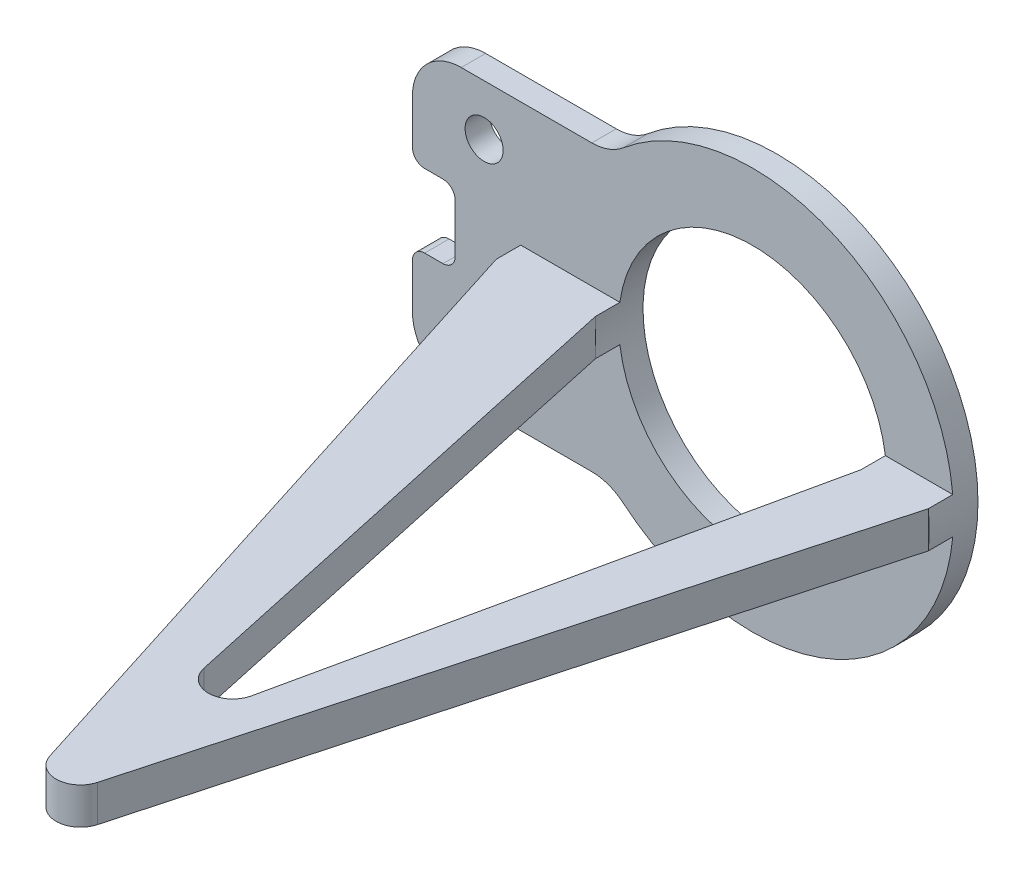
ISO-10303-21;
HEADER;
FILE_DESCRIPTION(('STEP AP214'),'2;1');
FILE_NAME('part.step','',(''),(''),'','','');
FILE_SCHEMA(('AUTOMOTIVE_DESIGN { 1 0 10303 214 1 1 1 1 }'));
ENDSEC;
DATA;
#1=APPLICATION_CONTEXT('core data for automotive mechanical design processes');
#2=APPLICATION_PROTOCOL_DEFINITION('international standard','automotive_design',2000,#1);
#3=PRODUCT_CONTEXT('',#1,'mechanical');
#4=PRODUCT('Part','Part','',(#3));
#5=PRODUCT_RELATED_PRODUCT_CATEGORY('part','',(#4));
#6=PRODUCT_DEFINITION_FORMATION('','',#4);
#7=PRODUCT_DEFINITION_CONTEXT('part definition',#1,'design');
#8=PRODUCT_DEFINITION('design','',#6,#7);
#9=PRODUCT_DEFINITION_SHAPE('','',#8);
#10=(LENGTH_UNIT() NAMED_UNIT(*) SI_UNIT(.MILLI.,.METRE.));
#11=(NAMED_UNIT(*) PLANE_ANGLE_UNIT() SI_UNIT($,.RADIAN.));
#12=(NAMED_UNIT(*) SI_UNIT($,.STERADIAN.) SOLID_ANGLE_UNIT());
#13=UNCERTAINTY_MEASURE_WITH_UNIT(LENGTH_MEASURE(1.E-05),#10,'distance_accuracy_value','');
#14=(GEOMETRIC_REPRESENTATION_CONTEXT(3) GLOBAL_UNCERTAINTY_ASSIGNED_CONTEXT((#13)) GLOBAL_UNIT_ASSIGNED_CONTEXT((#10,
#11,#12)) REPRESENTATION_CONTEXT('',''));
#15=CARTESIAN_POINT('',(0.,0.,0.));
#16=DIRECTION('',(0.,0.,1.));
#17=DIRECTION('',(1.,0.,0.));
#18=AXIS2_PLACEMENT_3D('',#15,#16,#17);
#19=CARTESIAN_POINT('',(-27.8733122804794,7.66726188957801,2.));
#20=DIRECTION('',(1.,0.,0.));
#21=DIRECTION('',(0.,0.,-1.));
#22=AXIS2_PLACEMENT_3D('',#19,#20,#21);
#23=PLANE('',#22);
#24=DIRECTION('',(0.,-1.,0.));
#25=VECTOR('',#24,1.);
#26=CARTESIAN_POINT('',(-27.8733122804794,7.66726188957801,0.));
#27=LINE('',#26,#25);
#28=CARTESIAN_POINT('',(-27.8733122804794,7.66726188957801,0.));
#29=VERTEX_POINT('',#28);
#30=CARTESIAN_POINT('',(-27.8733122804794,4.,0.));
#31=VERTEX_POINT('',#30);
#32=EDGE_CURVE('E381',#29,#31,#27,.T.);
#33=ORIENTED_EDGE('',*,*,#32,.T.);
#34=DIRECTION('',(0.,0.,1.));
#35=VECTOR('',#34,1.);
#36=CARTESIAN_POINT('',(-27.8733122804794,4.,2.));
#37=LINE('',#36,#35);
#38=CARTESIAN_POINT('',(-27.8733122804794,4.,2.));
#39=VERTEX_POINT('',#38);
#40=EDGE_CURVE('E418',#31,#39,#37,.T.);
#41=ORIENTED_EDGE('',*,*,#40,.T.);
#42=DIRECTION('',(0.,-1.,0.));
#43=VECTOR('',#42,1.);
#44=CARTESIAN_POINT('',(-27.8733122804794,7.66726188957801,2.));
#45=LINE('',#44,#43);
#46=CARTESIAN_POINT('',(-27.8733122804794,7.66726188957801,2.));
#47=VERTEX_POINT('',#46);
#48=EDGE_CURVE('E360',#47,#39,#45,.T.);
#49=ORIENTED_EDGE('',*,*,#48,.F.);
#50=DIRECTION('',(0.,0.,-1.));
#51=VECTOR('',#50,1.);
#52=CARTESIAN_POINT('',(-27.8733122804794,7.66726188957801,2.));
#53=LINE('',#52,#51);
#54=EDGE_CURVE('E415',#47,#29,#53,.T.);
#55=ORIENTED_EDGE('',*,*,#54,.T.);
#56=EDGE_LOOP('',(#33,#41,#49,#55));
#57=FACE_BOUND('',#56,.T.);
#58=ADVANCED_FACE('F39',(#57),#23,.F.);
#59=CARTESIAN_POINT('',(-23.8733122804794,7.66726188957804,2.));
#60=DIRECTION('',(0.,0.,1.));
#61=DIRECTION('',(1.,0.,0.));
#62=AXIS2_PLACEMENT_3D('',#59,#60,#61);
#63=PLANE('',#62);
#64=DIRECTION('',(1.,0.,0.));
#65=VECTOR('',#64,1.);
#66=CARTESIAN_POINT('',(-23.8733122804794,-3.,2.));
#67=LINE('',#66,#65);
#68=CARTESIAN_POINT('',(-26.8733122804794,-3.,2.));
#69=VERTEX_POINT('',#68);
#70=CARTESIAN_POINT('',(-25.3733122804794,-3.,2.));
#71=VERTEX_POINT('',#70);
#72=EDGE_CURVE('E456',#69,#71,#67,.T.);
#73=ORIENTED_EDGE('',*,*,#72,.F.);
#74=CARTESIAN_POINT('',(-26.8733122804794,-4.,2.));
#75=DIRECTION('',(0.,0.,1.));
#76=DIRECTION('',(1.,0.,0.));
#77=AXIS2_PLACEMENT_3D('',#74,#75,#76);
#78=CIRCLE('',#77,1.);
#79=CARTESIAN_POINT('',(-27.8733122804794,-4.,2.));
#80=VERTEX_POINT('',#79);
#81=EDGE_CURVE('E443',#69,#80,#78,.T.);
#82=ORIENTED_EDGE('',*,*,#81,.T.);
#83=CARTESIAN_POINT('',(-27.8733122804794,-7.66726188957804,2.));
#84=VERTEX_POINT('',#83);
#85=EDGE_CURVE('E358',#80,#84,#45,.T.);
#86=ORIENTED_EDGE('',*,*,#85,.T.);
#87=CARTESIAN_POINT('',(-23.8733122804794,-7.66726188957806,2.));
#88=DIRECTION('',(0.,0.,1.));
#89=DIRECTION('',(1.,0.,0.));
#90=AXIS2_PLACEMENT_3D('',#87,#88,#89);
#91=CIRCLE('',#90,4.);
#92=CARTESIAN_POINT('',(-23.8733122804794,-11.6672618895781,2.));
#93=VERTEX_POINT('',#92);
#94=EDGE_CURVE('E363',#84,#93,#91,.T.);
#95=ORIENTED_EDGE('',*,*,#94,.T.);
#96=DIRECTION('',(1.,0.,0.));
#97=VECTOR('',#96,1.);
#98=CARTESIAN_POINT('',(-23.8733122804794,-11.6672618895781,2.));
#99=LINE('',#98,#97);
#100=CARTESIAN_POINT('',(-13.173260362044,-11.6672618895781,2.));
#101=VERTEX_POINT('',#100);
#102=EDGE_CURVE('E365',#93,#101,#99,.T.);
#103=ORIENTED_EDGE('',*,*,#102,.T.);
#104=CARTESIAN_POINT('',(-13.173260362044,-15.6672618895781,2.));
#105=DIRECTION('',(0.,0.,-1.));
#106=DIRECTION('',(1.,0.,0.));
#107=AXIS2_PLACEMENT_3D('',#104,#105,#106);
#108=CIRCLE('',#107,4.);
#109=CARTESIAN_POINT('',(-10.5990303331877,-12.6056708393994,2.));
#110=VERTEX_POINT('',#109);
#111=EDGE_CURVE('E367',#101,#110,#108,.T.);
#112=ORIENTED_EDGE('',*,*,#111,.T.);
#113=CARTESIAN_POINT('',(0.,0.,2.));
#114=DIRECTION('',(0.,0.,1.));
#115=DIRECTION('',(-1.,0.,0.));
#116=AXIS2_PLACEMENT_3D('',#113,#114,#115);
#117=CIRCLE('',#116,16.4694377959637);
#118=CARTESIAN_POINT('',(16.4009872055043,-1.5,2.));
#119=VERTEX_POINT('',#118);
#120=EDGE_CURVE('E370',#110,#119,#117,.T.);
#121=ORIENTED_EDGE('',*,*,#120,.T.);
#122=DIRECTION('',(1.,0.,0.));
#123=VECTOR('',#122,1.);
#124=CARTESIAN_POINT('',(10.8781039636384,-1.5,2.));
#125=LINE('',#124,#123);
#126=CARTESIAN_POINT('',(10.8781039636384,-1.5,2.));
#127=VERTEX_POINT('',#126);
#128=EDGE_CURVE('E306',#127,#119,#125,.T.);
#129=ORIENTED_EDGE('',*,*,#128,.F.);
#130=CARTESIAN_POINT('',(0.,0.,2.));
#131=DIRECTION('',(0.,0.,1.));
#132=DIRECTION('',(1.,0.,0.));
#133=AXIS2_PLACEMENT_3D('',#130,#131,#132);
#134=CIRCLE('',#133,10.9810357363832);
#135=CARTESIAN_POINT('',(-10.8781039636384,-1.5,2.));
#136=VERTEX_POINT('',#135);
#137=EDGE_CURVE('E348',#136,#127,#134,.T.);
#138=ORIENTED_EDGE('',*,*,#137,.F.);
#139=DIRECTION('',(1.,0.,0.));
#140=VECTOR('',#139,1.);
#141=CARTESIAN_POINT('',(-19.,-1.5,2.));
#142=LINE('',#141,#140);
#143=CARTESIAN_POINT('',(-19.,-1.5,2.));
#144=VERTEX_POINT('',#143);
#145=EDGE_CURVE('E321',#144,#136,#142,.T.);
#146=ORIENTED_EDGE('',*,*,#145,.F.);
#147=DIRECTION('',(0.,-1.,0.));
#148=VECTOR('',#147,1.);
#149=CARTESIAN_POINT('',(-19.,1.5,2.));
#150=LINE('',#149,#148);
#151=CARTESIAN_POINT('',(-19.,1.5,2.));
#152=VERTEX_POINT('',#151);
#153=EDGE_CURVE('E309',#152,#144,#150,.T.);
#154=ORIENTED_EDGE('',*,*,#153,.F.);
#155=DIRECTION('',(-1.,0.,0.));
#156=VECTOR('',#155,1.);
#157=CARTESIAN_POINT('',(-19.,1.5,2.));
#158=LINE('',#157,#156);
#159=CARTESIAN_POINT('',(-10.8781039636384,1.5,2.));
#160=VERTEX_POINT('',#159);
#161=EDGE_CURVE('E315',#160,#152,#158,.T.);
#162=ORIENTED_EDGE('',*,*,#161,.F.);
#163=CARTESIAN_POINT('',(10.8781039636384,1.5,2.));
#164=VERTEX_POINT('',#163);
#165=EDGE_CURVE('E352',#164,#160,#134,.T.);
#166=ORIENTED_EDGE('',*,*,#165,.F.);
#167=DIRECTION('',(-1.,0.,0.));
#168=VECTOR('',#167,1.);
#169=CARTESIAN_POINT('',(10.8781039636384,1.5,2.));
#170=LINE('',#169,#168);
#171=CARTESIAN_POINT('',(16.4009872055043,1.5,2.));
#172=VERTEX_POINT('',#171);
#173=EDGE_CURVE('E303',#172,#164,#170,.T.);
#174=ORIENTED_EDGE('',*,*,#173,.F.);
#175=CARTESIAN_POINT('',(-10.5990303331877,12.6056708393993,2.));
#176=VERTEX_POINT('',#175);
#177=EDGE_CURVE('E369',#172,#176,#117,.T.);
#178=ORIENTED_EDGE('',*,*,#177,.T.);
#179=CARTESIAN_POINT('',(-13.1732603620441,15.667261889578,2.));
#180=DIRECTION('',(0.,0.,-1.));
#181=DIRECTION('',(-1.,0.,0.));
#182=AXIS2_PLACEMENT_3D('',#179,#180,#181);
#183=CIRCLE('',#182,4.);
#184=CARTESIAN_POINT('',(-13.1732603620441,11.667261889578,2.));
#185=VERTEX_POINT('',#184);
#186=EDGE_CURVE('E373',#176,#185,#183,.T.);
#187=ORIENTED_EDGE('',*,*,#186,.T.);
#188=DIRECTION('',(-1.,0.,0.));
#189=VECTOR('',#188,1.);
#190=CARTESIAN_POINT('',(-13.1732603620441,11.667261889578,2.));
#191=LINE('',#190,#189);
#192=CARTESIAN_POINT('',(-23.8733122804794,11.667261889578,2.));
#193=VERTEX_POINT('',#192);
#194=EDGE_CURVE('E375',#185,#193,#191,.T.);
#195=ORIENTED_EDGE('',*,*,#194,.T.);
#196=CARTESIAN_POINT('',(-23.8733122804794,7.66726188957804,2.));
#197=DIRECTION('',(0.,0.,1.));
#198=DIRECTION('',(1.,0.,0.));
#199=AXIS2_PLACEMENT_3D('',#196,#197,#198);
#200=CIRCLE('',#199,4.);
#201=EDGE_CURVE('E355',#193,#47,#200,.T.);
#202=ORIENTED_EDGE('',*,*,#201,.T.);
#203=ORIENTED_EDGE('',*,*,#48,.T.);
#204=CARTESIAN_POINT('',(-26.8733122804794,4.,2.));
#205=DIRECTION('',(0.,0.,1.));
#206=DIRECTION('',(1.,0.,0.));
#207=AXIS2_PLACEMENT_3D('',#204,#205,#206);
#208=CIRCLE('',#207,1.);
#209=CARTESIAN_POINT('',(-26.8733122804794,3.,2.));
#210=VERTEX_POINT('',#209);
#211=EDGE_CURVE('E421',#39,#210,#208,.T.);
#212=ORIENTED_EDGE('',*,*,#211,.T.);
#213=DIRECTION('',(-1.,0.,0.));
#214=VECTOR('',#213,1.);
#215=CARTESIAN_POINT('',(-23.8733122804794,3.,2.));
#216=LINE('',#215,#214);
#217=CARTESIAN_POINT('',(-25.3733122804794,3.,2.));
#218=VERTEX_POINT('',#217);
#219=EDGE_CURVE('E467',#218,#210,#216,.T.);
#220=ORIENTED_EDGE('',*,*,#219,.F.);
#221=CARTESIAN_POINT('',(-25.3733122804794,2.,2.));
#222=DIRECTION('',(0.,0.,1.));
#223=DIRECTION('',(1.,0.,0.));
#224=AXIS2_PLACEMENT_3D('',#221,#222,#223);
#225=CIRCLE('',#224,1.);
#226=CARTESIAN_POINT('',(-24.3733122804794,2.,2.));
#227=VERTEX_POINT('',#226);
#228=EDGE_CURVE('E11',#218,#227,#225,.F.);
#229=ORIENTED_EDGE('',*,*,#228,.T.);
#230=DIRECTION('',(0.,1.,0.));
#231=VECTOR('',#230,1.);
#232=CARTESIAN_POINT('',(-24.3733122804794,7.66726188957804,2.));
#233=LINE('',#232,#231);
#234=CARTESIAN_POINT('',(-24.3733122804794,-2.,2.));
#235=VERTEX_POINT('',#234);
#236=EDGE_CURVE('E256',#235,#227,#233,.T.);
#237=ORIENTED_EDGE('',*,*,#236,.F.);
#238=CARTESIAN_POINT('',(-25.3733122804794,-2.,2.));
#239=DIRECTION('',(0.,0.,1.));
#240=DIRECTION('',(1.,0.,0.));
#241=AXIS2_PLACEMENT_3D('',#238,#239,#240);
#242=CIRCLE('',#241,1.);
#243=EDGE_CURVE('E448',#235,#71,#242,.F.);
#244=ORIENTED_EDGE('',*,*,#243,.T.);
#245=EDGE_LOOP('',(#73,#82,#86,#95,#103,#112,#121,#129,#138,#146,#154,#162,#166,#174,#178,#187,
#195,#202,#203,#212,#220,#229,#237,#244));
#246=FACE_BOUND('',#245,.T.);
#247=CARTESIAN_POINT('',(-22.,7.49999999999999,2.));
#248=DIRECTION('',(0.,0.,1.));
#249=DIRECTION('',(1.,0.,0.));
#250=AXIS2_PLACEMENT_3D('',#247,#248,#249);
#251=CIRCLE('',#250,1.56);
#252=CARTESIAN_POINT('',(-20.44,7.49999999999999,2.));
#253=VERTEX_POINT('',#252);
#254=EDGE_CURVE('E342',#253,#253,#251,.T.);
#255=ORIENTED_EDGE('',*,*,#254,.F.);
#256=EDGE_LOOP('',(#255));
#257=FACE_BOUND('',#256,.T.);
#258=CARTESIAN_POINT('',(-22.,-7.50000000000001,2.));
#259=DIRECTION('',(0.,0.,1.));
#260=DIRECTION('',(1.,0.,0.));
#261=AXIS2_PLACEMENT_3D('',#258,#259,#260);
#262=CIRCLE('',#261,1.56);
#263=CARTESIAN_POINT('',(-20.44,-7.50000000000001,2.));
#264=VERTEX_POINT('',#263);
#265=EDGE_CURVE('E336',#264,#264,#262,.T.);
#266=ORIENTED_EDGE('',*,*,#265,.F.);
#267=EDGE_LOOP('',(#266));
#268=FACE_BOUND('',#267,.T.);
#269=ADVANCED_FACE('F454',(#246,#257,#268),#63,.T.);
#270=CARTESIAN_POINT('',(-23.8733122804794,7.66726188957804,0.));
#271=DIRECTION('',(0.,0.,1.));
#272=DIRECTION('',(1.,0.,0.));
#273=AXIS2_PLACEMENT_3D('',#270,#271,#272);
#274=PLANE('',#273);
#275=CARTESIAN_POINT('',(-27.8733122804794,-4.,0.));
#276=VERTEX_POINT('',#275);
#277=CARTESIAN_POINT('',(-27.8733122804794,-7.66726188957804,0.));
#278=VERTEX_POINT('',#277);
#279=EDGE_CURVE('E380',#276,#278,#27,.T.);
#280=ORIENTED_EDGE('',*,*,#279,.F.);
#281=CARTESIAN_POINT('',(-26.8733122804794,-4.,0.));
#282=DIRECTION('',(0.,0.,1.));
#283=DIRECTION('',(1.,0.,0.));
#284=AXIS2_PLACEMENT_3D('',#281,#282,#283);
#285=CIRCLE('',#284,1.);
#286=CARTESIAN_POINT('',(-26.8733122804794,-3.,0.));
#287=VERTEX_POINT('',#286);
#288=EDGE_CURVE('E441',#276,#287,#285,.F.);
#289=ORIENTED_EDGE('',*,*,#288,.T.);
#290=DIRECTION('',(-1.,0.,0.));
#291=VECTOR('',#290,1.);
#292=CARTESIAN_POINT('',(-24.3733122804794,-3.,0.));
#293=LINE('',#292,#291);
#294=CARTESIAN_POINT('',(-25.3733122804794,-3.,0.));
#295=VERTEX_POINT('',#294);
#296=EDGE_CURVE('E468',#295,#287,#293,.T.);
#297=ORIENTED_EDGE('',*,*,#296,.F.);
#298=CARTESIAN_POINT('',(-25.3733122804794,-2.,0.));
#299=DIRECTION('',(0.,0.,1.));
#300=DIRECTION('',(1.,0.,0.));
#301=AXIS2_PLACEMENT_3D('',#298,#299,#300);
#302=CIRCLE('',#301,1.);
#303=CARTESIAN_POINT('',(-24.3733122804794,-2.,0.));
#304=VERTEX_POINT('',#303);
#305=EDGE_CURVE('E446',#295,#304,#302,.T.);
#306=ORIENTED_EDGE('',*,*,#305,.T.);
#307=DIRECTION('',(0.,-1.,0.));
#308=VECTOR('',#307,1.);
#309=CARTESIAN_POINT('',(-24.3733122804794,3.,0.));
#310=LINE('',#309,#308);
#311=CARTESIAN_POINT('',(-24.3733122804794,2.,0.));
#312=VERTEX_POINT('',#311);
#313=EDGE_CURVE('E475',#312,#304,#310,.T.);
#314=ORIENTED_EDGE('',*,*,#313,.F.);
#315=CARTESIAN_POINT('',(-25.3733122804794,2.,0.));
#316=DIRECTION('',(0.,0.,1.));
#317=DIRECTION('',(1.,0.,0.));
#318=AXIS2_PLACEMENT_3D('',#315,#316,#317);
#319=CIRCLE('',#318,1.);
#320=CARTESIAN_POINT('',(-25.3733122804794,3.,0.));
#321=VERTEX_POINT('',#320);
#322=EDGE_CURVE('E47',#312,#321,#319,.T.);
#323=ORIENTED_EDGE('',*,*,#322,.T.);
#324=DIRECTION('',(1.,0.,0.));
#325=VECTOR('',#324,1.);
#326=CARTESIAN_POINT('',(-27.8733122804794,3.,0.));
#327=LINE('',#326,#325);
#328=CARTESIAN_POINT('',(-26.8733122804794,3.,0.));
#329=VERTEX_POINT('',#328);
#330=EDGE_CURVE('E479',#329,#321,#327,.T.);
#331=ORIENTED_EDGE('',*,*,#330,.F.);
#332=CARTESIAN_POINT('',(-26.8733122804794,4.,0.));
#333=DIRECTION('',(0.,0.,1.));
#334=DIRECTION('',(1.,0.,0.));
#335=AXIS2_PLACEMENT_3D('',#332,#333,#334);
#336=CIRCLE('',#335,1.);
#337=EDGE_CURVE('E426',#329,#31,#336,.F.);
#338=ORIENTED_EDGE('',*,*,#337,.T.);
#339=ORIENTED_EDGE('',*,*,#32,.F.);
#340=CARTESIAN_POINT('',(-23.8733122804794,7.66726188957804,0.));
#341=DIRECTION('',(0.,0.,1.));
#342=DIRECTION('',(1.,0.,0.));
#343=AXIS2_PLACEMENT_3D('',#340,#341,#342);
#344=CIRCLE('',#343,4.);
#345=CARTESIAN_POINT('',(-23.8733122804794,11.667261889578,0.));
#346=VERTEX_POINT('',#345);
#347=EDGE_CURVE('E351',#346,#29,#344,.T.);
#348=ORIENTED_EDGE('',*,*,#347,.F.);
#349=DIRECTION('',(-1.,0.,0.));
#350=VECTOR('',#349,1.);
#351=CARTESIAN_POINT('',(-13.1732603620441,11.667261889578,0.));
#352=LINE('',#351,#350);
#353=CARTESIAN_POINT('',(-13.1732603620441,11.667261889578,0.));
#354=VERTEX_POINT('',#353);
#355=EDGE_CURVE('E359',#354,#346,#352,.T.);
#356=ORIENTED_EDGE('',*,*,#355,.F.);
#357=CARTESIAN_POINT('',(-13.1732603620441,15.667261889578,0.));
#358=DIRECTION('',(0.,0.,-1.));
#359=DIRECTION('',(-1.,0.,0.));
#360=AXIS2_PLACEMENT_3D('',#357,#358,#359);
#361=CIRCLE('',#360,4.);
#362=CARTESIAN_POINT('',(-10.5990303331877,12.6056708393993,0.));
#363=VERTEX_POINT('',#362);
#364=EDGE_CURVE('E392',#363,#354,#361,.T.);
#365=ORIENTED_EDGE('',*,*,#364,.F.);
#366=CARTESIAN_POINT('',(0.,0.,0.));
#367=DIRECTION('',(0.,0.,1.));
#368=DIRECTION('',(-1.,0.,0.));
#369=AXIS2_PLACEMENT_3D('',#366,#367,#368);
#370=CIRCLE('',#369,16.4694377959637);
#371=CARTESIAN_POINT('',(-10.5990303331877,-12.6056708393994,0.));
#372=VERTEX_POINT('',#371);
#373=EDGE_CURVE('E390',#372,#363,#370,.T.);
#374=ORIENTED_EDGE('',*,*,#373,.F.);
#375=CARTESIAN_POINT('',(-13.173260362044,-15.6672618895781,0.));
#376=DIRECTION('',(0.,0.,-1.));
#377=DIRECTION('',(1.,0.,0.));
#378=AXIS2_PLACEMENT_3D('',#375,#376,#377);
#379=CIRCLE('',#378,4.);
#380=CARTESIAN_POINT('',(-13.173260362044,-11.6672618895781,0.));
#381=VERTEX_POINT('',#380);
#382=EDGE_CURVE('E388',#381,#372,#379,.T.);
#383=ORIENTED_EDGE('',*,*,#382,.F.);
#384=DIRECTION('',(1.,0.,0.));
#385=VECTOR('',#384,1.);
#386=CARTESIAN_POINT('',(-23.8733122804794,-11.6672618895781,0.));
#387=LINE('',#386,#385);
#388=CARTESIAN_POINT('',(-23.8733122804794,-11.6672618895781,0.));
#389=VERTEX_POINT('',#388);
#390=EDGE_CURVE('E386',#389,#381,#387,.T.);
#391=ORIENTED_EDGE('',*,*,#390,.F.);
#392=CARTESIAN_POINT('',(-23.8733122804794,-7.66726188957806,0.));
#393=DIRECTION('',(0.,0.,1.));
#394=DIRECTION('',(1.,0.,0.));
#395=AXIS2_PLACEMENT_3D('',#392,#393,#394);
#396=CIRCLE('',#395,4.);
#397=EDGE_CURVE('E384',#278,#389,#396,.T.);
#398=ORIENTED_EDGE('',*,*,#397,.F.);
#399=EDGE_LOOP('',(#280,#289,#297,#306,#314,#323,#331,#338,#339,#348,#356,#365,#374,#383,#391,#398));
#400=FACE_BOUND('',#399,.T.);
#401=CARTESIAN_POINT('',(0.,0.,0.));
#402=DIRECTION('',(0.,0.,1.));
#403=DIRECTION('',(1.,0.,0.));
#404=AXIS2_PLACEMENT_3D('',#401,#402,#403);
#405=CIRCLE('',#404,10.9810357363832);
#406=CARTESIAN_POINT('',(10.9810357363832,0.,0.));
#407=VERTEX_POINT('',#406);
#408=EDGE_CURVE('E345',#407,#407,#405,.T.);
#409=ORIENTED_EDGE('',*,*,#408,.T.);
#410=EDGE_LOOP('',(#409));
#411=FACE_BOUND('',#410,.T.);
#412=CARTESIAN_POINT('',(-22.,7.49999999999999,0.));
#413=DIRECTION('',(0.,0.,1.));
#414=DIRECTION('',(1.,0.,0.));
#415=AXIS2_PLACEMENT_3D('',#412,#413,#414);
#416=CIRCLE('',#415,1.56);
#417=CARTESIAN_POINT('',(-20.44,7.49999999999999,0.));
#418=VERTEX_POINT('',#417);
#419=EDGE_CURVE('E339',#418,#418,#416,.T.);
#420=ORIENTED_EDGE('',*,*,#419,.T.);
#421=EDGE_LOOP('',(#420));
#422=FACE_BOUND('',#421,.T.);
#423=CARTESIAN_POINT('',(-22.,-7.50000000000001,0.));
#424=DIRECTION('',(0.,0.,1.));
#425=DIRECTION('',(1.,0.,0.));
#426=AXIS2_PLACEMENT_3D('',#423,#424,#425);
#427=CIRCLE('',#426,1.56);
#428=CARTESIAN_POINT('',(-20.44,-7.50000000000001,0.));
#429=VERTEX_POINT('',#428);
#430=EDGE_CURVE('E335',#429,#429,#427,.T.);
#431=ORIENTED_EDGE('',*,*,#430,.T.);
#432=EDGE_LOOP('',(#431));
#433=FACE_BOUND('',#432,.T.);
#434=ADVANCED_FACE('F473',(#400,#411,#422,#433),#274,.F.);
#435=CARTESIAN_POINT('',(-23.8733122804794,7.66726188957804,2.));
#436=DIRECTION('',(0.,0.,-1.));
#437=DIRECTION('',(-1.,0.,0.));
#438=AXIS2_PLACEMENT_3D('',#435,#436,#437);
#439=CYLINDRICAL_SURFACE('',#438,4.);
#440=ORIENTED_EDGE('',*,*,#347,.T.);
#441=ORIENTED_EDGE('',*,*,#54,.F.);
#442=ORIENTED_EDGE('',*,*,#201,.F.);
#443=DIRECTION('',(0.,0.,-1.));
#444=VECTOR('',#443,1.);
#445=CARTESIAN_POINT('',(-23.8733122804794,11.667261889578,2.));
#446=LINE('',#445,#444);
#447=EDGE_CURVE('E377',#193,#346,#446,.T.);
#448=ORIENTED_EDGE('',*,*,#447,.T.);
#449=EDGE_LOOP('',(#440,#441,#442,#448));
#450=FACE_BOUND('',#449,.T.);
#451=ADVANCED_FACE('F496',(#450),#439,.T.);
#452=ORIENTED_EDGE('',*,*,#85,.F.);
#453=DIRECTION('',(0.,0.,-1.));
#454=VECTOR('',#453,1.);
#455=CARTESIAN_POINT('',(-27.8733122804794,-4.,2.));
#456=LINE('',#455,#454);
#457=EDGE_CURVE('E438',#80,#276,#456,.T.);
#458=ORIENTED_EDGE('',*,*,#457,.T.);
#459=ORIENTED_EDGE('',*,*,#279,.T.);
#460=DIRECTION('',(0.,0.,-1.));
#461=VECTOR('',#460,1.);
#462=CARTESIAN_POINT('',(-27.8733122804794,-7.66726188957804,2.));
#463=LINE('',#462,#461);
#464=EDGE_CURVE('E412',#84,#278,#463,.T.);
#465=ORIENTED_EDGE('',*,*,#464,.F.);
#466=EDGE_LOOP('',(#452,#458,#459,#465));
#467=FACE_BOUND('',#466,.T.);
#468=ADVANCED_FACE('F532',(#467),#23,.F.);
#469=CARTESIAN_POINT('',(-23.8733122804794,-7.66726188957806,2.));
#470=DIRECTION('',(0.,0.,-1.));
#471=DIRECTION('',(-1.,0.,0.));
#472=AXIS2_PLACEMENT_3D('',#469,#470,#471);
#473=CYLINDRICAL_SURFACE('',#472,4.);
#474=ORIENTED_EDGE('',*,*,#397,.T.);
#475=DIRECTION('',(0.,0.,-1.));
#476=VECTOR('',#475,1.);
#477=CARTESIAN_POINT('',(-23.8733122804794,-11.6672618895781,2.));
#478=LINE('',#477,#476);
#479=EDGE_CURVE('E409',#93,#389,#478,.T.);
#480=ORIENTED_EDGE('',*,*,#479,.F.);
#481=ORIENTED_EDGE('',*,*,#94,.F.);
#482=ORIENTED_EDGE('',*,*,#464,.T.);
#483=EDGE_LOOP('',(#474,#480,#481,#482));
#484=FACE_BOUND('',#483,.T.);
#485=ADVANCED_FACE('F528',(#484),#473,.T.);
#486=CARTESIAN_POINT('',(-23.8733122804794,-11.6672618895781,2.));
#487=DIRECTION('',(0.,1.,0.));
#488=DIRECTION('',(-1.,0.,0.));
#489=AXIS2_PLACEMENT_3D('',#486,#487,#488);
#490=PLANE('',#489);
#491=ORIENTED_EDGE('',*,*,#390,.T.);
#492=DIRECTION('',(0.,0.,-1.));
#493=VECTOR('',#492,1.);
#494=CARTESIAN_POINT('',(-13.173260362044,-11.6672618895781,2.));
#495=LINE('',#494,#493);
#496=EDGE_CURVE('E406',#101,#381,#495,.T.);
#497=ORIENTED_EDGE('',*,*,#496,.F.);
#498=ORIENTED_EDGE('',*,*,#102,.F.);
#499=ORIENTED_EDGE('',*,*,#479,.T.);
#500=EDGE_LOOP('',(#491,#497,#498,#499));
#501=FACE_BOUND('',#500,.T.);
#502=ADVANCED_FACE('F524',(#501),#490,.F.);
#503=CARTESIAN_POINT('',(-13.173260362044,-15.6672618895781,2.));
#504=DIRECTION('',(0.,0.,-1.));
#505=DIRECTION('',(-1.,0.,0.));
#506=AXIS2_PLACEMENT_3D('',#503,#504,#505);
#507=CYLINDRICAL_SURFACE('',#506,4.);
#508=ORIENTED_EDGE('',*,*,#382,.T.);
#509=DIRECTION('',(0.,0.,-1.));
#510=VECTOR('',#509,1.);
#511=CARTESIAN_POINT('',(-10.5990303331877,-12.6056708393994,2.));
#512=LINE('',#511,#510);
#513=EDGE_CURVE('E403',#110,#372,#512,.T.);
#514=ORIENTED_EDGE('',*,*,#513,.F.);
#515=ORIENTED_EDGE('',*,*,#111,.F.);
#516=ORIENTED_EDGE('',*,*,#496,.T.);
#517=EDGE_LOOP('',(#508,#514,#515,#516));
#518=FACE_BOUND('',#517,.T.);
#519=ADVANCED_FACE('F519',(#518),#507,.F.);
#520=CARTESIAN_POINT('',(0.,0.,2.));
#521=DIRECTION('',(0.,0.,-1.));
#522=DIRECTION('',(-1.,0.,0.));
#523=AXIS2_PLACEMENT_3D('',#520,#521,#522);
#524=CYLINDRICAL_SURFACE('',#523,16.4694377959637);
#525=ORIENTED_EDGE('',*,*,#373,.T.);
#526=DIRECTION('',(0.,0.,-1.));
#527=VECTOR('',#526,1.);
#528=CARTESIAN_POINT('',(-10.5990303331877,12.6056708393993,2.));
#529=LINE('',#528,#527);
#530=EDGE_CURVE('E400',#176,#363,#529,.T.);
#531=ORIENTED_EDGE('',*,*,#530,.F.);
#532=ORIENTED_EDGE('',*,*,#177,.F.);
#533=DIRECTION('',(0.,0.,-1.));
#534=VECTOR('',#533,1.);
#535=CARTESIAN_POINT('',(16.4009872055043,1.5,4.));
#536=LINE('',#535,#534);
#537=CARTESIAN_POINT('',(16.4009872055043,1.5,4.));
#538=VERTEX_POINT('',#537);
#539=EDGE_CURVE('E298',#538,#172,#536,.T.);
#540=ORIENTED_EDGE('',*,*,#539,.F.);
#541=CARTESIAN_POINT('',(-4.68375338513738E-13,0.,4.));
#542=DIRECTION('',(0.,0.,1.));
#543=DIRECTION('',(-1.,0.,0.));
#544=AXIS2_PLACEMENT_3D('',#541,#542,#543);
#545=CIRCLE('',#544,16.4694377959641);
#546=CARTESIAN_POINT('',(16.4009872055043,-1.5,4.));
#547=VERTEX_POINT('',#546);
#548=EDGE_CURVE('E302',#547,#538,#545,.T.);
#549=ORIENTED_EDGE('',*,*,#548,.F.);
#550=DIRECTION('',(0.,0.,-1.));
#551=VECTOR('',#550,1.);
#552=CARTESIAN_POINT('',(16.4009872055043,-1.5,4.));
#553=LINE('',#552,#551);
#554=EDGE_CURVE('E295',#547,#119,#553,.T.);
#555=ORIENTED_EDGE('',*,*,#554,.T.);
#556=ORIENTED_EDGE('',*,*,#120,.F.);
#557=ORIENTED_EDGE('',*,*,#513,.T.);
#558=EDGE_LOOP('',(#525,#531,#532,#540,#549,#555,#556,#557));
#559=FACE_BOUND('',#558,.T.);
#560=ADVANCED_FACE('F511',(#559),#524,.T.);
#561=CARTESIAN_POINT('',(-13.1732603620441,15.667261889578,2.));
#562=DIRECTION('',(0.,0.,-1.));
#563=DIRECTION('',(-1.,0.,0.));
#564=AXIS2_PLACEMENT_3D('',#561,#562,#563);
#565=CYLINDRICAL_SURFACE('',#564,4.);
#566=ORIENTED_EDGE('',*,*,#364,.T.);
#567=DIRECTION('',(0.,0.,-1.));
#568=VECTOR('',#567,1.);
#569=CARTESIAN_POINT('',(-13.1732603620441,11.667261889578,2.));
#570=LINE('',#569,#568);
#571=EDGE_CURVE('E397',#185,#354,#570,.T.);
#572=ORIENTED_EDGE('',*,*,#571,.F.);
#573=ORIENTED_EDGE('',*,*,#186,.F.);
#574=ORIENTED_EDGE('',*,*,#530,.T.);
#575=EDGE_LOOP('',(#566,#572,#573,#574));
#576=FACE_BOUND('',#575,.T.);
#577=ADVANCED_FACE('F507',(#576),#565,.F.);
#578=CARTESIAN_POINT('',(-13.1732603620441,11.667261889578,2.));
#579=DIRECTION('',(0.,-1.,0.));
#580=DIRECTION('',(0.,0.,-1.));
#581=AXIS2_PLACEMENT_3D('',#578,#579,#580);
#582=PLANE('',#581);
#583=ORIENTED_EDGE('',*,*,#355,.T.);
#584=ORIENTED_EDGE('',*,*,#447,.F.);
#585=ORIENTED_EDGE('',*,*,#194,.F.);
#586=ORIENTED_EDGE('',*,*,#571,.T.);
#587=EDGE_LOOP('',(#583,#584,#585,#586));
#588=FACE_BOUND('',#587,.T.);
#589=ADVANCED_FACE('F502',(#588),#582,.F.);
#590=CARTESIAN_POINT('',(0.,0.,2.));
#591=DIRECTION('',(0.,0.,-1.));
#592=DIRECTION('',(-1.,0.,0.));
#593=AXIS2_PLACEMENT_3D('',#590,#591,#592);
#594=CYLINDRICAL_SURFACE('',#593,10.9810357363832);
#595=ORIENTED_EDGE('',*,*,#137,.T.);
#596=DIRECTION('',(0.,0.,-1.));
#597=VECTOR('',#596,1.);
#598=CARTESIAN_POINT('',(10.8781039636384,-1.5,4.));
#599=LINE('',#598,#597);
#600=CARTESIAN_POINT('',(10.8781039636384,-1.5,4.));
#601=VERTEX_POINT('',#600);
#602=EDGE_CURVE('E282',#601,#127,#599,.T.);
#603=ORIENTED_EDGE('',*,*,#602,.F.);
#604=CARTESIAN_POINT('',(-8.2572837456496E-13,0.,4.));
#605=DIRECTION('',(0.,0.,-1.));
#606=DIRECTION('',(-1.,0.,0.));
#607=AXIS2_PLACEMENT_3D('',#604,#605,#606);
#608=CIRCLE('',#607,10.981035736384);
#609=CARTESIAN_POINT('',(10.8781039636384,1.5,4.));
#610=VERTEX_POINT('',#609);
#611=EDGE_CURVE('E307',#610,#601,#608,.T.);
#612=ORIENTED_EDGE('',*,*,#611,.F.);
#613=DIRECTION('',(0.,0.,-1.));
#614=VECTOR('',#613,1.);
#615=CARTESIAN_POINT('',(10.8781039636384,1.5,4.));
#616=LINE('',#615,#614);
#617=EDGE_CURVE('E300',#610,#164,#616,.T.);
#618=ORIENTED_EDGE('',*,*,#617,.T.);
#619=ORIENTED_EDGE('',*,*,#165,.T.);
#620=DIRECTION('',(0.,0.,-1.));
#621=VECTOR('',#620,1.);
#622=CARTESIAN_POINT('',(-10.8781039636384,1.5,4.));
#623=LINE('',#622,#621);
#624=CARTESIAN_POINT('',(-10.8781039636384,1.5,4.));
#625=VERTEX_POINT('',#624);
#626=EDGE_CURVE('E327',#625,#160,#623,.T.);
#627=ORIENTED_EDGE('',*,*,#626,.F.);
#628=CARTESIAN_POINT('',(1.6826817716975E-13,0.,4.));
#629=DIRECTION('',(0.,0.,-1.));
#630=DIRECTION('',(1.,0.,0.));
#631=AXIS2_PLACEMENT_3D('',#628,#629,#630);
#632=CIRCLE('',#631,10.9810357363834);
#633=CARTESIAN_POINT('',(-10.8781039636384,-1.5,4.));
#634=VERTEX_POINT('',#633);
#635=EDGE_CURVE('E314',#634,#625,#632,.T.);
#636=ORIENTED_EDGE('',*,*,#635,.F.);
#637=DIRECTION('',(0.,0.,-1.));
#638=VECTOR('',#637,1.);
#639=CARTESIAN_POINT('',(-10.8781039636384,-1.5,4.));
#640=LINE('',#639,#638);
#641=EDGE_CURVE('E330',#634,#136,#640,.T.);
#642=ORIENTED_EDGE('',*,*,#641,.T.);
#643=EDGE_LOOP('',(#595,#603,#612,#618,#619,#627,#636,#642));
#644=FACE_BOUND('',#643,.T.);
#645=ORIENTED_EDGE('',*,*,#408,.F.);
#646=EDGE_LOOP('',(#645));
#647=FACE_BOUND('',#646,.T.);
#648=ADVANCED_FACE('F541',(#644,#647),#594,.F.);
#649=CARTESIAN_POINT('',(-22.,7.49999999999999,2.));
#650=DIRECTION('',(0.,0.,-1.));
#651=DIRECTION('',(-1.,0.,0.));
#652=AXIS2_PLACEMENT_3D('',#649,#650,#651);
#653=CYLINDRICAL_SURFACE('',#652,1.56);
#654=ORIENTED_EDGE('',*,*,#254,.T.);
#655=EDGE_LOOP('',(#654));
#656=FACE_BOUND('',#655,.T.);
#657=ORIENTED_EDGE('',*,*,#419,.F.);
#658=EDGE_LOOP('',(#657));
#659=FACE_BOUND('',#658,.T.);
#660=ADVANCED_FACE('F748',(#656,#659),#653,.F.);
#661=CARTESIAN_POINT('',(-22.,-7.50000000000001,2.));
#662=DIRECTION('',(0.,0.,-1.));
#663=DIRECTION('',(-1.,0.,0.));
#664=AXIS2_PLACEMENT_3D('',#661,#662,#663);
#665=CYLINDRICAL_SURFACE('',#664,1.56);
#666=ORIENTED_EDGE('',*,*,#265,.T.);
#667=EDGE_LOOP('',(#666));
#668=FACE_BOUND('',#667,.T.);
#669=ORIENTED_EDGE('',*,*,#430,.F.);
#670=EDGE_LOOP('',(#669));
#671=FACE_BOUND('',#670,.T.);
#672=ADVANCED_FACE('F737',(#668,#671),#665,.F.);
#673=CARTESIAN_POINT('',(-19.,1.5,4.));
#674=DIRECTION('',(1.,0.,0.));
#675=DIRECTION('',(0.,0.,-1.));
#676=AXIS2_PLACEMENT_3D('',#673,#674,#675);
#677=PLANE('',#676);
#678=ORIENTED_EDGE('',*,*,#153,.T.);
#679=DIRECTION('',(0.,0.,-1.));
#680=VECTOR('',#679,1.);
#681=CARTESIAN_POINT('',(-19.,-1.5,4.));
#682=LINE('',#681,#680);
#683=CARTESIAN_POINT('',(-19.,-1.5,4.));
#684=VERTEX_POINT('',#683);
#685=EDGE_CURVE('E333',#684,#144,#682,.T.);
#686=ORIENTED_EDGE('',*,*,#685,.F.);
#687=DIRECTION('',(0.,-1.,0.));
#688=VECTOR('',#687,1.);
#689=CARTESIAN_POINT('',(-19.,1.5,4.));
#690=LINE('',#689,#688);
#691=CARTESIAN_POINT('',(-19.,1.5,4.));
#692=VERTEX_POINT('',#691);
#693=EDGE_CURVE('E249',#692,#684,#690,.T.);
#694=ORIENTED_EDGE('',*,*,#693,.F.);
#695=DIRECTION('',(0.,0.,-1.));
#696=VECTOR('',#695,1.);
#697=CARTESIAN_POINT('',(-19.,1.5,4.));
#698=LINE('',#697,#696);
#699=EDGE_CURVE('E318',#692,#152,#698,.T.);
#700=ORIENTED_EDGE('',*,*,#699,.T.);
#701=EDGE_LOOP('',(#678,#686,#694,#700));
#702=FACE_BOUND('',#701,.T.);
#703=ADVANCED_FACE('F566',(#702),#677,.F.);
#704=CARTESIAN_POINT('',(-19.,-1.5,4.));
#705=DIRECTION('',(0.,1.,0.));
#706=DIRECTION('',(0.,0.,1.));
#707=AXIS2_PLACEMENT_3D('',#704,#705,#706);
#708=PLANE('',#707);
#709=ORIENTED_EDGE('',*,*,#145,.T.);
#710=ORIENTED_EDGE('',*,*,#641,.F.);
#711=DIRECTION('',(-0.212588982515872,0.,-0.977141711581727));
#712=VECTOR('',#711,1.);
#713=CARTESIAN_POINT('',(-10.8781039636384,-1.5,4.));
#714=LINE('',#713,#712);
#715=CARTESIAN_POINT('',(-1.95428342316349,-1.5,45.0173527036699));
#716=VERTEX_POINT('',#715);
#717=EDGE_CURVE('E234',#716,#634,#714,.T.);
#718=ORIENTED_EDGE('',*,*,#717,.F.);
#719=CARTESIAN_POINT('',(0.,-1.5,44.5921747386383));
#720=DIRECTION('',(0.,-1.,0.));
#721=DIRECTION('',(0.,0.,1.));
#722=AXIS2_PLACEMENT_3D('',#719,#720,#721);
#723=CIRCLE('',#722,2.);
#724=CARTESIAN_POINT('',(1.95428342316349,-1.5,45.0173527036699));
#725=VERTEX_POINT('',#724);
#726=EDGE_CURVE('E263',#725,#716,#723,.T.);
#727=ORIENTED_EDGE('',*,*,#726,.F.);
#728=DIRECTION('',(-0.212588982515872,0.,0.977141711581727));
#729=VECTOR('',#728,1.);
#730=CARTESIAN_POINT('',(10.8781039636384,-1.5,4.));
#731=LINE('',#730,#729);
#732=EDGE_CURVE('E260',#601,#725,#731,.T.);
#733=ORIENTED_EDGE('',*,*,#732,.F.);
#734=ORIENTED_EDGE('',*,*,#602,.T.);
#735=ORIENTED_EDGE('',*,*,#128,.T.);
#736=ORIENTED_EDGE('',*,*,#554,.F.);
#737=DIRECTION('',(0.263676273692245,0.,-0.964611228781716));
#738=VECTOR('',#737,1.);
#739=CARTESIAN_POINT('',(1.7883573300718,-1.5,57.4576231015962));
#740=LINE('',#739,#738);
#741=CARTESIAN_POINT('',(1.7883573300718,-1.5,57.4576231015962));
#742=VERTEX_POINT('',#741);
#743=EDGE_CURVE('E245',#742,#547,#740,.T.);
#744=ORIENTED_EDGE('',*,*,#743,.F.);
#745=CARTESIAN_POINT('',(-0.140865127491658,-1.5,56.9302705542118));
#746=DIRECTION('',(0.,1.,0.));
#747=DIRECTION('',(0.,0.,1.));
#748=AXIS2_PLACEMENT_3D('',#745,#746,#747);
#749=CIRCLE('',#748,2.);
#750=CARTESIAN_POINT('',(-2.04754957819317,-1.5,57.5340539636005));
#751=VERTEX_POINT('',#750);
#752=EDGE_CURVE('E226',#751,#742,#749,.T.);
#753=ORIENTED_EDGE('',*,*,#752,.F.);
#754=DIRECTION('',(0.301891704694402,0.,0.953342225350744));
#755=VECTOR('',#754,1.);
#756=CARTESIAN_POINT('',(-19.,-1.5,4.));
#757=LINE('',#756,#755);
#758=EDGE_CURVE('E242',#684,#751,#757,.T.);
#759=ORIENTED_EDGE('',*,*,#758,.F.);
#760=ORIENTED_EDGE('',*,*,#685,.T.);
#761=EDGE_LOOP('',(#709,#710,#718,#727,#733,#734,#735,#736,#744,#753,#759,#760));
#762=FACE_BOUND('',#761,.T.);
#763=ADVANCED_FACE('F240',(#762),#708,.F.);
#764=CARTESIAN_POINT('',(-19.,1.5,4.));
#765=DIRECTION('',(0.,-1.,0.));
#766=DIRECTION('',(0.,0.,-1.));
#767=AXIS2_PLACEMENT_3D('',#764,#765,#766);
#768=PLANE('',#767);
#769=ORIENTED_EDGE('',*,*,#161,.T.);
#770=ORIENTED_EDGE('',*,*,#699,.F.);
#771=DIRECTION('',(0.301891704694402,0.,0.953342225350744));
#772=VECTOR('',#771,1.);
#773=CARTESIAN_POINT('',(-19.,1.5,4.));
#774=LINE('',#773,#772);
#775=CARTESIAN_POINT('',(-2.04754957819317,1.5,57.5340539636005));
#776=VERTEX_POINT('',#775);
#777=EDGE_CURVE('E268',#692,#776,#774,.T.);
#778=ORIENTED_EDGE('',*,*,#777,.T.);
#779=CARTESIAN_POINT('',(-0.140865127491658,1.5,56.9302705542118));
#780=DIRECTION('',(0.,1.,0.));
#781=DIRECTION('',(0.,0.,1.));
#782=AXIS2_PLACEMENT_3D('',#779,#780,#781);
#783=CIRCLE('',#782,2.);
#784=CARTESIAN_POINT('',(1.7883573300718,1.5,57.4576231015962));
#785=VERTEX_POINT('',#784);
#786=EDGE_CURVE('E228',#776,#785,#783,.T.);
#787=ORIENTED_EDGE('',*,*,#786,.T.);
#788=DIRECTION('',(0.263676273692245,0.,-0.964611228781716));
#789=VECTOR('',#788,1.);
#790=CARTESIAN_POINT('',(1.7883573300718,1.5,57.4576231015962));
#791=LINE('',#790,#789);
#792=EDGE_CURVE('E271',#785,#538,#791,.T.);
#793=ORIENTED_EDGE('',*,*,#792,.T.);
#794=ORIENTED_EDGE('',*,*,#539,.T.);
#795=ORIENTED_EDGE('',*,*,#173,.T.);
#796=ORIENTED_EDGE('',*,*,#617,.F.);
#797=DIRECTION('',(-0.212588982515872,0.,0.977141711581727));
#798=VECTOR('',#797,1.);
#799=CARTESIAN_POINT('',(10.8781039636384,1.5,4.));
#800=LINE('',#799,#798);
#801=CARTESIAN_POINT('',(1.95428342316349,1.5,45.0173527036699));
#802=VERTEX_POINT('',#801);
#803=EDGE_CURVE('E274',#610,#802,#800,.T.);
#804=ORIENTED_EDGE('',*,*,#803,.T.);
#805=CARTESIAN_POINT('',(0.,1.5,44.5921747386383));
#806=DIRECTION('',(0.,-1.,0.));
#807=DIRECTION('',(0.,0.,1.));
#808=AXIS2_PLACEMENT_3D('',#805,#806,#807);
#809=CIRCLE('',#808,2.);
#810=CARTESIAN_POINT('',(-1.95428342316349,1.5,45.0173527036699));
#811=VERTEX_POINT('',#810);
#812=EDGE_CURVE('E253',#802,#811,#809,.T.);
#813=ORIENTED_EDGE('',*,*,#812,.T.);
#814=DIRECTION('',(-0.212588982515872,0.,-0.977141711581727));
#815=VECTOR('',#814,1.);
#816=CARTESIAN_POINT('',(-10.8781039636384,1.5,4.));
#817=LINE('',#816,#815);
#818=EDGE_CURVE('E250',#811,#625,#817,.T.);
#819=ORIENTED_EDGE('',*,*,#818,.T.);
#820=ORIENTED_EDGE('',*,*,#626,.T.);
#821=EDGE_LOOP('',(#769,#770,#778,#787,#793,#794,#795,#796,#804,#813,#819,#820));
#822=FACE_BOUND('',#821,.T.);
#823=ADVANCED_FACE('F552',(#822),#768,.F.);
#824=CARTESIAN_POINT('',(-8.2572837456496E-13,0.,4.));
#825=DIRECTION('',(0.,0.,-1.));
#826=DIRECTION('',(-1.,0.,0.));
#827=AXIS2_PLACEMENT_3D('',#824,#825,#826);
#828=PLANE('',#827);
#829=ORIENTED_EDGE('',*,*,#548,.T.);
#830=DIRECTION('',(0.,1.,0.));
#831=VECTOR('',#830,1.);
#832=CARTESIAN_POINT('',(16.4009872055043,-1.5,4.));
#833=LINE('',#832,#831);
#834=EDGE_CURVE('E290',#547,#538,#833,.T.);
#835=ORIENTED_EDGE('',*,*,#834,.F.);
#836=EDGE_LOOP('',(#829,#835));
#837=FACE_BOUND('',#836,.T.);
#838=ADVANCED_FACE('F571',(#837),#828,.F.);
#839=CARTESIAN_POINT('',(-19.,-1.5,4.));
#840=DIRECTION('',(0.,0.,-1.));
#841=DIRECTION('',(-1.,0.,0.));
#842=AXIS2_PLACEMENT_3D('',#839,#840,#841);
#843=PLANE('',#842);
#844=DIRECTION('',(0.,1.,0.));
#845=VECTOR('',#844,1.);
#846=CARTESIAN_POINT('',(-10.8781039636384,-1.5,4.));
#847=LINE('',#846,#845);
#848=EDGE_CURVE('E279',#634,#625,#847,.T.);
#849=ORIENTED_EDGE('',*,*,#848,.F.);
#850=ORIENTED_EDGE('',*,*,#635,.T.);
#851=EDGE_LOOP('',(#849,#850));
#852=FACE_BOUND('',#851,.T.);
#853=ADVANCED_FACE('F564',(#852),#843,.T.);
#854=CARTESIAN_POINT('',(-10.8781039636384,-1.5,4.));
#855=DIRECTION('',(0.977141711581727,0.,-0.212588982515872));
#856=DIRECTION('',(-0.212588982515872,0.,-0.977141711581727));
#857=AXIS2_PLACEMENT_3D('',#854,#855,#856);
#858=PLANE('',#857);
#859=ORIENTED_EDGE('',*,*,#818,.F.);
#860=DIRECTION('',(0.,1.,0.));
#861=VECTOR('',#860,1.);
#862=CARTESIAN_POINT('',(-1.95428342316349,-1.5,45.0173527036699));
#863=LINE('',#862,#861);
#864=EDGE_CURVE('E283',#716,#811,#863,.T.);
#865=ORIENTED_EDGE('',*,*,#864,.F.);
#866=ORIENTED_EDGE('',*,*,#717,.T.);
#867=ORIENTED_EDGE('',*,*,#848,.T.);
#868=EDGE_LOOP('',(#859,#865,#866,#867));
#869=FACE_BOUND('',#868,.T.);
#870=ADVANCED_FACE('F560',(#869),#858,.T.);
#871=CARTESIAN_POINT('',(0.,-1.5,44.5921747386383));
#872=DIRECTION('',(0.,1.,0.));
#873=DIRECTION('',(0.,0.,1.));
#874=AXIS2_PLACEMENT_3D('',#871,#872,#873);
#875=CYLINDRICAL_SURFACE('',#874,2.);
#876=ORIENTED_EDGE('',*,*,#812,.F.);
#877=DIRECTION('',(0.,1.,0.));
#878=VECTOR('',#877,1.);
#879=CARTESIAN_POINT('',(1.95428342316349,-1.5,45.0173527036699));
#880=LINE('',#879,#878);
#881=EDGE_CURVE('E285',#725,#802,#880,.T.);
#882=ORIENTED_EDGE('',*,*,#881,.F.);
#883=ORIENTED_EDGE('',*,*,#726,.T.);
#884=ORIENTED_EDGE('',*,*,#864,.T.);
#885=EDGE_LOOP('',(#876,#882,#883,#884));
#886=FACE_BOUND('',#885,.T.);
#887=ADVANCED_FACE('F687',(#886),#875,.F.);
#888=CARTESIAN_POINT('',(10.8781039636384,-1.5,4.));
#889=DIRECTION('',(-0.977141711581727,0.,-0.212588982515872));
#890=DIRECTION('',(-0.212588982515872,0.,0.977141711581727));
#891=AXIS2_PLACEMENT_3D('',#888,#889,#890);
#892=PLANE('',#891);
#893=ORIENTED_EDGE('',*,*,#803,.F.);
#894=DIRECTION('',(0.,1.,0.));
#895=VECTOR('',#894,1.);
#896=CARTESIAN_POINT('',(10.8781039636384,-1.5,4.));
#897=LINE('',#896,#895);
#898=EDGE_CURVE('E287',#601,#610,#897,.T.);
#899=ORIENTED_EDGE('',*,*,#898,.F.);
#900=ORIENTED_EDGE('',*,*,#732,.T.);
#901=ORIENTED_EDGE('',*,*,#881,.T.);
#902=EDGE_LOOP('',(#893,#899,#900,#901));
#903=FACE_BOUND('',#902,.T.);
#904=ADVANCED_FACE('F549',(#903),#892,.T.);
#905=CARTESIAN_POINT('',(16.4009872055043,-1.5,4.));
#906=DIRECTION('',(0.,0.,-1.));
#907=DIRECTION('',(-1.,0.,0.));
#908=AXIS2_PLACEMENT_3D('',#905,#906,#907);
#909=PLANE('',#908);
#910=ORIENTED_EDGE('',*,*,#898,.T.);
#911=ORIENTED_EDGE('',*,*,#611,.T.);
#912=EDGE_LOOP('',(#910,#911));
#913=FACE_BOUND('',#912,.T.);
#914=ADVANCED_FACE('F546',(#913),#909,.T.);
#915=CARTESIAN_POINT('',(1.7883573300718,-1.5,57.4576231015962));
#916=DIRECTION('',(0.964611228781716,0.,0.263676273692245));
#917=DIRECTION('',(0.263676273692245,0.,-0.964611228781716));
#918=AXIS2_PLACEMENT_3D('',#915,#916,#917);
#919=PLANE('',#918);
#920=ORIENTED_EDGE('',*,*,#792,.F.);
#921=DIRECTION('',(0.,1.,0.));
#922=VECTOR('',#921,1.);
#923=CARTESIAN_POINT('',(1.7883573300718,-1.5,57.4576231015962));
#924=LINE('',#923,#922);
#925=EDGE_CURVE('E233',#742,#785,#924,.T.);
#926=ORIENTED_EDGE('',*,*,#925,.F.);
#927=ORIENTED_EDGE('',*,*,#743,.T.);
#928=ORIENTED_EDGE('',*,*,#834,.T.);
#929=EDGE_LOOP('',(#920,#926,#927,#928));
#930=FACE_BOUND('',#929,.T.);
#931=ADVANCED_FACE('F569',(#930),#919,.T.);
#932=CARTESIAN_POINT('',(-0.140865127491658,-1.5,56.9302705542118));
#933=DIRECTION('',(0.,1.,0.));
#934=DIRECTION('',(0.,0.,1.));
#935=AXIS2_PLACEMENT_3D('',#932,#933,#934);
#936=CYLINDRICAL_SURFACE('',#935,2.);
#937=ORIENTED_EDGE('',*,*,#786,.F.);
#938=DIRECTION('',(0.,1.,0.));
#939=VECTOR('',#938,1.);
#940=CARTESIAN_POINT('',(-2.04754957819317,-1.5,57.5340539636005));
#941=LINE('',#940,#939);
#942=EDGE_CURVE('E223',#751,#776,#941,.T.);
#943=ORIENTED_EDGE('',*,*,#942,.F.);
#944=ORIENTED_EDGE('',*,*,#752,.T.);
#945=ORIENTED_EDGE('',*,*,#925,.T.);
#946=EDGE_LOOP('',(#937,#943,#944,#945));
#947=FACE_BOUND('',#946,.T.);
#948=ADVANCED_FACE('F225',(#947),#936,.T.);
#949=CARTESIAN_POINT('',(-19.,-1.5,4.));
#950=DIRECTION('',(-0.953342225350743,0.,0.301891704694402));
#951=DIRECTION('',(0.301891704694402,0.,0.953342225350744));
#952=AXIS2_PLACEMENT_3D('',#949,#950,#951);
#953=PLANE('',#952);
#954=ORIENTED_EDGE('',*,*,#777,.F.);
#955=ORIENTED_EDGE('',*,*,#693,.T.);
#956=ORIENTED_EDGE('',*,*,#758,.T.);
#957=ORIENTED_EDGE('',*,*,#942,.T.);
#958=EDGE_LOOP('',(#954,#955,#956,#957));
#959=FACE_BOUND('',#958,.T.);
#960=ADVANCED_FACE('F248',(#959),#953,.T.);
#961=CARTESIAN_POINT('',(-27.8733122804794,3.,10.));
#962=DIRECTION('',(0.,1.,0.));
#963=DIRECTION('',(0.,0.,1.));
#964=AXIS2_PLACEMENT_3D('',#961,#962,#963);
#965=PLANE('',#964);
#966=ORIENTED_EDGE('',*,*,#330,.T.);
#967=DIRECTION('',(0.,0.,-1.));
#968=VECTOR('',#967,1.);
#969=CARTESIAN_POINT('',(-25.3733122804794,3.,2.));
#970=LINE('',#969,#968);
#971=EDGE_CURVE('E54',#321,#218,#970,.F.);
#972=ORIENTED_EDGE('',*,*,#971,.T.);
#973=ORIENTED_EDGE('',*,*,#219,.T.);
#974=DIRECTION('',(0.,0.,1.));
#975=VECTOR('',#974,1.);
#976=CARTESIAN_POINT('',(-26.8733122804794,3.,10.));
#977=LINE('',#976,#975);
#978=EDGE_CURVE('E424',#210,#329,#977,.F.);
#979=ORIENTED_EDGE('',*,*,#978,.T.);
#980=EDGE_LOOP('',(#966,#972,#973,#979));
#981=FACE_BOUND('',#980,.T.);
#982=ADVANCED_FACE('F490',(#981),#965,.F.);
#983=CARTESIAN_POINT('',(-24.3733122804794,-3.,10.));
#984=DIRECTION('',(0.,-1.,0.));
#985=DIRECTION('',(0.,0.,-1.));
#986=AXIS2_PLACEMENT_3D('',#983,#984,#985);
#987=PLANE('',#986);
#988=ORIENTED_EDGE('',*,*,#72,.T.);
#989=DIRECTION('',(0.,0.,-1.));
#990=VECTOR('',#989,1.);
#991=CARTESIAN_POINT('',(-25.3733122804794,-3.,0.));
#992=LINE('',#991,#990);
#993=EDGE_CURVE('E430',#71,#295,#992,.T.);
#994=ORIENTED_EDGE('',*,*,#993,.T.);
#995=ORIENTED_EDGE('',*,*,#296,.T.);
#996=DIRECTION('',(0.,0.,-1.));
#997=VECTOR('',#996,1.);
#998=CARTESIAN_POINT('',(-26.8733122804794,-3.,10.));
#999=LINE('',#998,#997);
#1000=EDGE_CURVE('E428',#287,#69,#999,.F.);
#1001=ORIENTED_EDGE('',*,*,#1000,.T.);
#1002=EDGE_LOOP('',(#988,#994,#995,#1001));
#1003=FACE_BOUND('',#1002,.T.);
#1004=ADVANCED_FACE('F463',(#1003),#987,.F.);
#1005=CARTESIAN_POINT('',(-24.3733122804794,3.,10.));
#1006=DIRECTION('',(1.,0.,0.));
#1007=DIRECTION('',(0.,0.,-1.));
#1008=AXIS2_PLACEMENT_3D('',#1005,#1006,#1007);
#1009=PLANE('',#1008);
#1010=ORIENTED_EDGE('',*,*,#313,.T.);
#1011=DIRECTION('',(0.,0.,-1.));
#1012=VECTOR('',#1011,1.);
#1013=CARTESIAN_POINT('',(-24.3733122804794,-2.,2.));
#1014=LINE('',#1013,#1012);
#1015=EDGE_CURVE('E436',#304,#235,#1014,.F.);
#1016=ORIENTED_EDGE('',*,*,#1015,.T.);
#1017=ORIENTED_EDGE('',*,*,#236,.T.);
#1018=DIRECTION('',(0.,0.,-1.));
#1019=VECTOR('',#1018,1.);
#1020=CARTESIAN_POINT('',(-24.3733122804794,2.,0.));
#1021=LINE('',#1020,#1019);
#1022=EDGE_CURVE('E433',#227,#312,#1021,.T.);
#1023=ORIENTED_EDGE('',*,*,#1022,.T.);
#1024=EDGE_LOOP('',(#1010,#1016,#1017,#1023));
#1025=FACE_BOUND('',#1024,.T.);
#1026=ADVANCED_FACE('F477',(#1025),#1009,.F.);
#1027=CARTESIAN_POINT('',(-26.8733122804794,4.,2.));
#1028=DIRECTION('',(0.,0.,1.));
#1029=DIRECTION('',(1.,0.,0.));
#1030=AXIS2_PLACEMENT_3D('',#1027,#1028,#1029);
#1031=CYLINDRICAL_SURFACE('',#1030,1.);
#1032=ORIENTED_EDGE('',*,*,#337,.F.);
#1033=ORIENTED_EDGE('',*,*,#978,.F.);
#1034=ORIENTED_EDGE('',*,*,#211,.F.);
#1035=ORIENTED_EDGE('',*,*,#40,.F.);
#1036=EDGE_LOOP('',(#1032,#1033,#1034,#1035));
#1037=FACE_BOUND('',#1036,.T.);
#1038=ADVANCED_FACE('F489',(#1037),#1031,.T.);
#1039=CARTESIAN_POINT('',(-25.3733122804794,-2.,10.));
#1040=DIRECTION('',(0.,0.,1.));
#1041=DIRECTION('',(1.,0.,0.));
#1042=AXIS2_PLACEMENT_3D('',#1039,#1040,#1041);
#1043=CYLINDRICAL_SURFACE('',#1042,1.);
#1044=ORIENTED_EDGE('',*,*,#243,.F.);
#1045=ORIENTED_EDGE('',*,*,#1015,.F.);
#1046=ORIENTED_EDGE('',*,*,#305,.F.);
#1047=ORIENTED_EDGE('',*,*,#993,.F.);
#1048=EDGE_LOOP('',(#1044,#1045,#1046,#1047));
#1049=FACE_BOUND('',#1048,.T.);
#1050=ADVANCED_FACE('F470',(#1049),#1043,.F.);
#1051=CARTESIAN_POINT('',(-26.8733122804794,-4.,2.));
#1052=DIRECTION('',(0.,0.,-1.));
#1053=DIRECTION('',(-1.,0.,0.));
#1054=AXIS2_PLACEMENT_3D('',#1051,#1052,#1053);
#1055=CYLINDRICAL_SURFACE('',#1054,1.);
#1056=ORIENTED_EDGE('',*,*,#81,.F.);
#1057=ORIENTED_EDGE('',*,*,#1000,.F.);
#1058=ORIENTED_EDGE('',*,*,#288,.F.);
#1059=ORIENTED_EDGE('',*,*,#457,.F.);
#1060=EDGE_LOOP('',(#1056,#1057,#1058,#1059));
#1061=FACE_BOUND('',#1060,.T.);
#1062=ADVANCED_FACE('F535',(#1061),#1055,.T.);
#1063=CARTESIAN_POINT('',(-25.3733122804794,2.,10.));
#1064=DIRECTION('',(0.,0.,1.));
#1065=DIRECTION('',(1.,0.,0.));
#1066=AXIS2_PLACEMENT_3D('',#1063,#1064,#1065);
#1067=CYLINDRICAL_SURFACE('',#1066,1.);
#1068=ORIENTED_EDGE('',*,*,#228,.F.);
#1069=ORIENTED_EDGE('',*,*,#971,.F.);
#1070=ORIENTED_EDGE('',*,*,#322,.F.);
#1071=ORIENTED_EDGE('',*,*,#1022,.F.);
#1072=EDGE_LOOP('',(#1068,#1069,#1070,#1071));
#1073=FACE_BOUND('',#1072,.T.);
#1074=ADVANCED_FACE('F41',(#1073),#1067,.F.);
#1075=CLOSED_SHELL('',(#58,#269,#434,#451,#468,#485,#502,#519,#560,#577,#589,#648,#660,#672,
#703,#763,#823,#838,#853,#870,#887,#904,#914,#931,#948,#960,#982,#1004,#1026,#1038,#1050,#1062,#1074));
#1076=MANIFOLD_SOLID_BREP('B2',#1075);
#1077=ADVANCED_BREP_SHAPE_REPRESENTATION('',(#18,#1076),#14);
#1078=SHAPE_DEFINITION_REPRESENTATION(#9,#1077);
ENDSEC;
END-ISO-10303-21;
